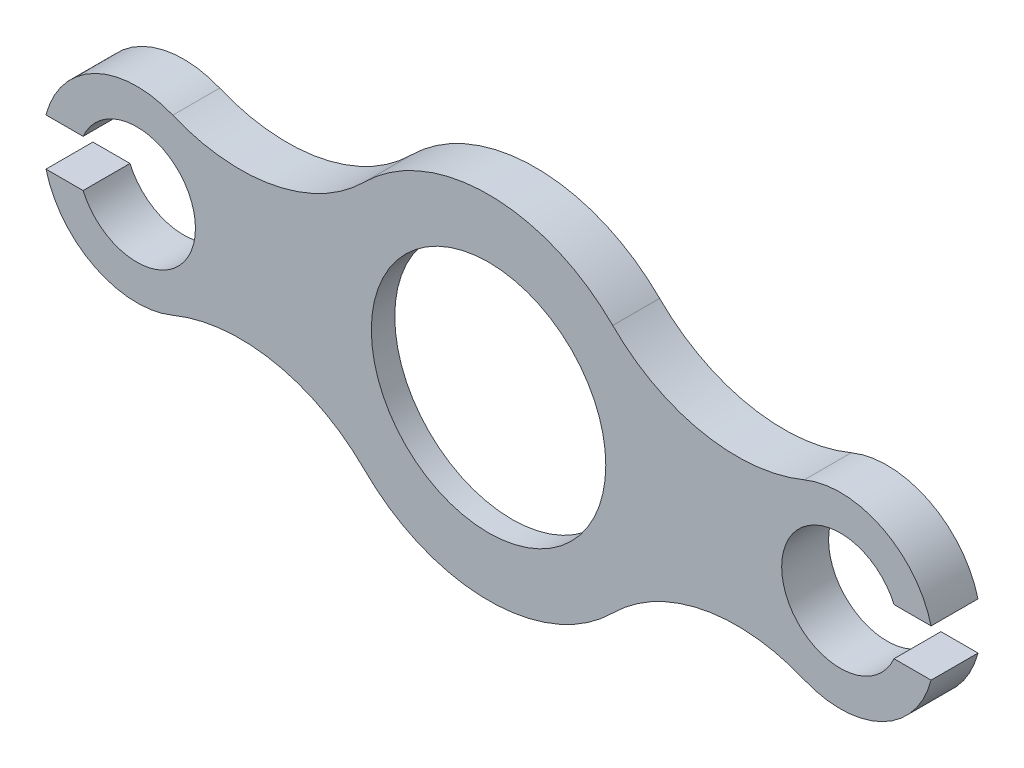
ISO-10303-21;
HEADER;
FILE_DESCRIPTION(('STEP AP214'),'2;1');
FILE_NAME('part.step','',(''),(''),'','','');
FILE_SCHEMA(('AUTOMOTIVE_DESIGN { 1 0 10303 214 1 1 1 1 }'));
ENDSEC;
DATA;
#1=APPLICATION_CONTEXT('core data for automotive mechanical design processes');
#2=APPLICATION_PROTOCOL_DEFINITION('international standard','automotive_design',2000,#1);
#3=PRODUCT_CONTEXT('',#1,'mechanical');
#4=PRODUCT('Part','Part','',(#3));
#5=PRODUCT_RELATED_PRODUCT_CATEGORY('part','',(#4));
#6=PRODUCT_DEFINITION_FORMATION('','',#4);
#7=PRODUCT_DEFINITION_CONTEXT('part definition',#1,'design');
#8=PRODUCT_DEFINITION('design','',#6,#7);
#9=PRODUCT_DEFINITION_SHAPE('','',#8);
#10=(LENGTH_UNIT() NAMED_UNIT(*) SI_UNIT(.MILLI.,.METRE.));
#11=(NAMED_UNIT(*) PLANE_ANGLE_UNIT() SI_UNIT($,.RADIAN.));
#12=(NAMED_UNIT(*) SI_UNIT($,.STERADIAN.) SOLID_ANGLE_UNIT());
#13=UNCERTAINTY_MEASURE_WITH_UNIT(LENGTH_MEASURE(1.E-05),#10,'distance_accuracy_value','');
#14=(GEOMETRIC_REPRESENTATION_CONTEXT(3) GLOBAL_UNCERTAINTY_ASSIGNED_CONTEXT((#13)) GLOBAL_UNIT_ASSIGNED_CONTEXT((#10,
#11,#12)) REPRESENTATION_CONTEXT('',''));
#15=CARTESIAN_POINT('',(0.,0.,0.));
#16=DIRECTION('',(0.,0.,1.));
#17=DIRECTION('',(1.,0.,0.));
#18=AXIS2_PLACEMENT_3D('',#15,#16,#17);
#19=CARTESIAN_POINT('',(-105.916666666667,-106.215157685813,20.));
#20=DIRECTION('',(0.,0.,-1.));
#21=DIRECTION('',(-1.,0.,0.));
#22=AXIS2_PLACEMENT_3D('',#19,#20,#21);
#23=CYLINDRICAL_SURFACE('',#22,75.);
#24=CARTESIAN_POINT('',(-105.916666666667,-106.215157685813,0.));
#25=DIRECTION('',(0.,0.,1.));
#26=DIRECTION('',(1.,0.,0.));
#27=AXIS2_PLACEMENT_3D('',#24,#25,#26);
#28=CIRCLE('',#27,75.);
#29=CARTESIAN_POINT('',(-134.666666666667,-36.9444026733264,0.));
#30=VERTEX_POINT('',#29);
#31=CARTESIAN_POINT('',(-52.9583333333333,-53.1075788429067,0.));
#32=VERTEX_POINT('',#31);
#33=EDGE_CURVE('E195',#30,#32,#28,.F.);
#34=ORIENTED_EDGE('',*,*,#33,.T.);
#35=DIRECTION('',(0.,0.,-1.));
#36=VECTOR('',#35,1.);
#37=CARTESIAN_POINT('',(-52.9583333333333,-53.1075788429067,20.));
#38=LINE('',#37,#36);
#39=CARTESIAN_POINT('',(-52.9583333333333,-53.1075788429067,20.));
#40=VERTEX_POINT('',#39);
#41=EDGE_CURVE('E11',#40,#32,#38,.T.);
#42=ORIENTED_EDGE('',*,*,#41,.F.);
#43=CARTESIAN_POINT('',(-105.916666666667,-106.215157685813,20.));
#44=DIRECTION('',(0.,0.,1.));
#45=DIRECTION('',(1.,0.,0.));
#46=AXIS2_PLACEMENT_3D('',#43,#44,#45);
#47=CIRCLE('',#46,75.);
#48=CARTESIAN_POINT('',(-134.666666666667,-36.9444026733264,20.));
#49=VERTEX_POINT('',#48);
#50=EDGE_CURVE('E233',#49,#40,#47,.F.);
#51=ORIENTED_EDGE('',*,*,#50,.F.);
#52=DIRECTION('',(0.,0.,-1.));
#53=VECTOR('',#52,1.);
#54=CARTESIAN_POINT('',(-134.666666666667,-36.9444026733264,20.));
#55=LINE('',#54,#53);
#56=EDGE_CURVE('E194',#49,#30,#55,.T.);
#57=ORIENTED_EDGE('',*,*,#56,.T.);
#58=EDGE_LOOP('',(#34,#42,#51,#57));
#59=FACE_BOUND('',#58,.T.);
#60=ADVANCED_FACE('F45',(#59),#23,.F.);
#61=CARTESIAN_POINT('',(0.,0.,20.));
#62=DIRECTION('',(0.,0.,-1.));
#63=DIRECTION('',(-1.,0.,0.));
#64=AXIS2_PLACEMENT_3D('',#61,#62,#63);
#65=CYLINDRICAL_SURFACE('',#64,75.);
#66=CARTESIAN_POINT('',(0.,0.,0.));
#67=DIRECTION('',(0.,0.,1.));
#68=DIRECTION('',(1.,0.,0.));
#69=AXIS2_PLACEMENT_3D('',#66,#67,#68);
#70=CIRCLE('',#69,75.);
#71=CARTESIAN_POINT('',(52.9583333333333,-53.1075788429067,0.));
#72=VERTEX_POINT('',#71);
#73=EDGE_CURVE('E198',#32,#72,#70,.T.);
#74=ORIENTED_EDGE('',*,*,#73,.T.);
#75=DIRECTION('',(0.,0.,-1.));
#76=VECTOR('',#75,1.);
#77=CARTESIAN_POINT('',(52.9583333333333,-53.1075788429067,20.));
#78=LINE('',#77,#76);
#79=CARTESIAN_POINT('',(52.9583333333333,-53.1075788429067,20.));
#80=VERTEX_POINT('',#79);
#81=EDGE_CURVE('E54',#80,#72,#78,.T.);
#82=ORIENTED_EDGE('',*,*,#81,.F.);
#83=CARTESIAN_POINT('',(0.,0.,20.));
#84=DIRECTION('',(0.,0.,1.));
#85=DIRECTION('',(1.,0.,0.));
#86=AXIS2_PLACEMENT_3D('',#83,#84,#85);
#87=CIRCLE('',#86,75.);
#88=EDGE_CURVE('E128',#40,#80,#87,.T.);
#89=ORIENTED_EDGE('',*,*,#88,.F.);
#90=ORIENTED_EDGE('',*,*,#41,.T.);
#91=EDGE_LOOP('',(#74,#82,#89,#90));
#92=FACE_BOUND('',#91,.T.);
#93=ADVANCED_FACE('F265',(#92),#65,.T.);
#94=CARTESIAN_POINT('',(105.916666666667,-106.215157685813,20.));
#95=DIRECTION('',(0.,0.,-1.));
#96=DIRECTION('',(-1.,0.,0.));
#97=AXIS2_PLACEMENT_3D('',#94,#95,#96);
#98=CYLINDRICAL_SURFACE('',#97,75.);
#99=CARTESIAN_POINT('',(105.916666666667,-106.215157685813,0.));
#100=DIRECTION('',(0.,0.,1.));
#101=DIRECTION('',(1.,0.,0.));
#102=AXIS2_PLACEMENT_3D('',#99,#100,#101);
#103=CIRCLE('',#102,75.);
#104=CARTESIAN_POINT('',(134.666666666667,-36.9444026733264,0.));
#105=VERTEX_POINT('',#104);
#106=EDGE_CURVE('E201',#105,#72,#103,.T.);
#107=ORIENTED_EDGE('',*,*,#106,.F.);
#108=DIRECTION('',(0.,0.,-1.));
#109=VECTOR('',#108,1.);
#110=CARTESIAN_POINT('',(134.666666666667,-36.9444026733264,20.));
#111=LINE('',#110,#109);
#112=CARTESIAN_POINT('',(134.666666666667,-36.9444026733264,20.));
#113=VERTEX_POINT('',#112);
#114=EDGE_CURVE('E257',#113,#105,#111,.T.);
#115=ORIENTED_EDGE('',*,*,#114,.F.);
#116=CARTESIAN_POINT('',(105.916666666667,-106.215157685813,20.));
#117=DIRECTION('',(0.,0.,1.));
#118=DIRECTION('',(1.,0.,0.));
#119=AXIS2_PLACEMENT_3D('',#116,#117,#118);
#120=CIRCLE('',#119,75.);
#121=EDGE_CURVE('E264',#113,#80,#120,.T.);
#122=ORIENTED_EDGE('',*,*,#121,.T.);
#123=ORIENTED_EDGE('',*,*,#81,.T.);
#124=EDGE_LOOP('',(#107,#115,#122,#123));
#125=FACE_BOUND('',#124,.T.);
#126=ADVANCED_FACE('F262',(#125),#98,.F.);
#127=CARTESIAN_POINT('',(150.,0.,20.));
#128=DIRECTION('',(0.,0.,-1.));
#129=DIRECTION('',(-1.,0.,0.));
#130=AXIS2_PLACEMENT_3D('',#127,#128,#129);
#131=CYLINDRICAL_SURFACE('',#130,40.);
#132=CARTESIAN_POINT('',(150.,0.,0.));
#133=DIRECTION('',(0.,0.,1.));
#134=DIRECTION('',(1.,0.,0.));
#135=AXIS2_PLACEMENT_3D('',#132,#133,#134);
#136=CIRCLE('',#135,40.);
#137=CARTESIAN_POINT('',(188.729833462074,-10.,0.));
#138=VERTEX_POINT('',#137);
#139=EDGE_CURVE('E205',#138,#105,#136,.F.);
#140=ORIENTED_EDGE('',*,*,#139,.F.);
#141=DIRECTION('',(0.,0.,-1.));
#142=VECTOR('',#141,1.);
#143=CARTESIAN_POINT('',(188.729833462074,-10.,20.));
#144=LINE('',#143,#142);
#145=CARTESIAN_POINT('',(188.729833462074,-10.,20.));
#146=VERTEX_POINT('',#145);
#147=EDGE_CURVE('E255',#146,#138,#144,.T.);
#148=ORIENTED_EDGE('',*,*,#147,.F.);
#149=CARTESIAN_POINT('',(150.,0.,20.));
#150=DIRECTION('',(0.,0.,1.));
#151=DIRECTION('',(1.,0.,0.));
#152=AXIS2_PLACEMENT_3D('',#149,#150,#151);
#153=CIRCLE('',#152,40.);
#154=EDGE_CURVE('E277',#146,#113,#153,.F.);
#155=ORIENTED_EDGE('',*,*,#154,.T.);
#156=ORIENTED_EDGE('',*,*,#114,.T.);
#157=EDGE_LOOP('',(#140,#148,#155,#156));
#158=FACE_BOUND('',#157,.T.);
#159=ADVANCED_FACE('F274',(#158),#131,.T.);
#160=CARTESIAN_POINT('',(0.,-10.,20.));
#161=DIRECTION('',(0.,1.,0.));
#162=DIRECTION('',(0.,0.,1.));
#163=AXIS2_PLACEMENT_3D('',#160,#161,#162);
#164=PLANE('',#163);
#165=DIRECTION('',(1.,0.,0.));
#166=VECTOR('',#165,1.);
#167=CARTESIAN_POINT('',(0.,-10.,0.));
#168=LINE('',#167,#166);
#169=CARTESIAN_POINT('',(172.912878474779,-10.,0.));
#170=VERTEX_POINT('',#169);
#171=EDGE_CURVE('E208',#170,#138,#168,.T.);
#172=ORIENTED_EDGE('',*,*,#171,.F.);
#173=DIRECTION('',(0.,0.,-1.));
#174=VECTOR('',#173,1.);
#175=CARTESIAN_POINT('',(172.912878474779,-10.,20.));
#176=LINE('',#175,#174);
#177=CARTESIAN_POINT('',(172.912878474779,-10.,20.));
#178=VERTEX_POINT('',#177);
#179=EDGE_CURVE('E253',#178,#170,#176,.T.);
#180=ORIENTED_EDGE('',*,*,#179,.F.);
#181=DIRECTION('',(1.,0.,0.));
#182=VECTOR('',#181,1.);
#183=CARTESIAN_POINT('',(0.,-10.,20.));
#184=LINE('',#183,#182);
#185=EDGE_CURVE('E281',#178,#146,#184,.T.);
#186=ORIENTED_EDGE('',*,*,#185,.T.);
#187=ORIENTED_EDGE('',*,*,#147,.T.);
#188=EDGE_LOOP('',(#172,#180,#186,#187));
#189=FACE_BOUND('',#188,.T.);
#190=ADVANCED_FACE('F363',(#189),#164,.T.);
#191=CARTESIAN_POINT('',(150.,0.,20.));
#192=DIRECTION('',(0.,0.,-1.));
#193=DIRECTION('',(-1.,0.,0.));
#194=AXIS2_PLACEMENT_3D('',#191,#192,#193);
#195=CYLINDRICAL_SURFACE('',#194,25.);
#196=CARTESIAN_POINT('',(150.,0.,0.));
#197=DIRECTION('',(0.,0.,1.));
#198=DIRECTION('',(1.,0.,0.));
#199=AXIS2_PLACEMENT_3D('',#196,#197,#198);
#200=CIRCLE('',#199,25.);
#201=CARTESIAN_POINT('',(172.912878474779,10.,0.));
#202=VERTEX_POINT('',#201);
#203=EDGE_CURVE('E211',#170,#202,#200,.F.);
#204=ORIENTED_EDGE('',*,*,#203,.T.);
#205=DIRECTION('',(0.,0.,-1.));
#206=VECTOR('',#205,1.);
#207=CARTESIAN_POINT('',(172.912878474779,10.,20.));
#208=LINE('',#207,#206);
#209=CARTESIAN_POINT('',(172.912878474779,10.,20.));
#210=VERTEX_POINT('',#209);
#211=EDGE_CURVE('E250',#210,#202,#208,.T.);
#212=ORIENTED_EDGE('',*,*,#211,.F.);
#213=CARTESIAN_POINT('',(150.,0.,20.));
#214=DIRECTION('',(0.,0.,1.));
#215=DIRECTION('',(1.,0.,0.));
#216=AXIS2_PLACEMENT_3D('',#213,#214,#215);
#217=CIRCLE('',#216,25.);
#218=EDGE_CURVE('E288',#178,#210,#217,.F.);
#219=ORIENTED_EDGE('',*,*,#218,.F.);
#220=ORIENTED_EDGE('',*,*,#179,.T.);
#221=EDGE_LOOP('',(#204,#212,#219,#220));
#222=FACE_BOUND('',#221,.T.);
#223=ADVANCED_FACE('F365',(#222),#195,.F.);
#224=CARTESIAN_POINT('',(0.,10.,20.));
#225=DIRECTION('',(0.,1.,0.));
#226=DIRECTION('',(0.,0.,1.));
#227=AXIS2_PLACEMENT_3D('',#224,#225,#226);
#228=PLANE('',#227);
#229=DIRECTION('',(1.,0.,0.));
#230=VECTOR('',#229,1.);
#231=CARTESIAN_POINT('',(0.,10.,0.));
#232=LINE('',#231,#230);
#233=CARTESIAN_POINT('',(188.729833462074,10.,0.));
#234=VERTEX_POINT('',#233);
#235=EDGE_CURVE('E213',#202,#234,#232,.T.);
#236=ORIENTED_EDGE('',*,*,#235,.T.);
#237=DIRECTION('',(0.,0.,-1.));
#238=VECTOR('',#237,1.);
#239=CARTESIAN_POINT('',(188.729833462074,10.,20.));
#240=LINE('',#239,#238);
#241=CARTESIAN_POINT('',(188.729833462074,10.,20.));
#242=VERTEX_POINT('',#241);
#243=EDGE_CURVE('E248',#242,#234,#240,.T.);
#244=ORIENTED_EDGE('',*,*,#243,.F.);
#245=DIRECTION('',(1.,0.,0.));
#246=VECTOR('',#245,1.);
#247=CARTESIAN_POINT('',(0.,10.,20.));
#248=LINE('',#247,#246);
#249=EDGE_CURVE('E290',#210,#242,#248,.T.);
#250=ORIENTED_EDGE('',*,*,#249,.F.);
#251=ORIENTED_EDGE('',*,*,#211,.T.);
#252=EDGE_LOOP('',(#236,#244,#250,#251));
#253=FACE_BOUND('',#252,.T.);
#254=ADVANCED_FACE('F359',(#253),#228,.F.);
#255=CARTESIAN_POINT('',(150.,0.,20.));
#256=DIRECTION('',(0.,0.,-1.));
#257=DIRECTION('',(-1.,0.,0.));
#258=AXIS2_PLACEMENT_3D('',#255,#256,#257);
#259=CYLINDRICAL_SURFACE('',#258,40.);
#260=CARTESIAN_POINT('',(150.,0.,0.));
#261=DIRECTION('',(0.,0.,1.));
#262=DIRECTION('',(1.,0.,0.));
#263=AXIS2_PLACEMENT_3D('',#260,#261,#262);
#264=CIRCLE('',#263,40.);
#265=CARTESIAN_POINT('',(134.666666666667,36.9444026733264,0.));
#266=VERTEX_POINT('',#265);
#267=EDGE_CURVE('E216',#266,#234,#264,.F.);
#268=ORIENTED_EDGE('',*,*,#267,.F.);
#269=DIRECTION('',(0.,0.,-1.));
#270=VECTOR('',#269,1.);
#271=CARTESIAN_POINT('',(134.666666666667,36.9444026733264,20.));
#272=LINE('',#271,#270);
#273=CARTESIAN_POINT('',(134.666666666667,36.9444026733264,20.));
#274=VERTEX_POINT('',#273);
#275=EDGE_CURVE('E246',#274,#266,#272,.T.);
#276=ORIENTED_EDGE('',*,*,#275,.F.);
#277=CARTESIAN_POINT('',(150.,0.,20.));
#278=DIRECTION('',(0.,0.,1.));
#279=DIRECTION('',(1.,0.,0.));
#280=AXIS2_PLACEMENT_3D('',#277,#278,#279);
#281=CIRCLE('',#280,40.);
#282=EDGE_CURVE('E292',#274,#242,#281,.F.);
#283=ORIENTED_EDGE('',*,*,#282,.T.);
#284=ORIENTED_EDGE('',*,*,#243,.T.);
#285=EDGE_LOOP('',(#268,#276,#283,#284));
#286=FACE_BOUND('',#285,.T.);
#287=ADVANCED_FACE('F342',(#286),#259,.T.);
#288=CARTESIAN_POINT('',(105.916666666667,106.215157685813,20.));
#289=DIRECTION('',(0.,0.,-1.));
#290=DIRECTION('',(-1.,0.,0.));
#291=AXIS2_PLACEMENT_3D('',#288,#289,#290);
#292=CYLINDRICAL_SURFACE('',#291,75.);
#293=CARTESIAN_POINT('',(105.916666666667,106.215157685813,0.));
#294=DIRECTION('',(0.,0.,1.));
#295=DIRECTION('',(1.,0.,0.));
#296=AXIS2_PLACEMENT_3D('',#293,#294,#295);
#297=CIRCLE('',#296,75.);
#298=CARTESIAN_POINT('',(52.9583333333334,53.1075788429067,0.));
#299=VERTEX_POINT('',#298);
#300=EDGE_CURVE('E219',#266,#299,#297,.F.);
#301=ORIENTED_EDGE('',*,*,#300,.T.);
#302=DIRECTION('',(0.,0.,-1.));
#303=VECTOR('',#302,1.);
#304=CARTESIAN_POINT('',(52.9583333333334,53.1075788429067,20.));
#305=LINE('',#304,#303);
#306=CARTESIAN_POINT('',(52.9583333333334,53.1075788429067,20.));
#307=VERTEX_POINT('',#306);
#308=EDGE_CURVE('E243',#307,#299,#305,.T.);
#309=ORIENTED_EDGE('',*,*,#308,.F.);
#310=CARTESIAN_POINT('',(105.916666666667,106.215157685813,20.));
#311=DIRECTION('',(0.,0.,1.));
#312=DIRECTION('',(1.,0.,0.));
#313=AXIS2_PLACEMENT_3D('',#310,#311,#312);
#314=CIRCLE('',#313,75.);
#315=EDGE_CURVE('E295',#274,#307,#314,.F.);
#316=ORIENTED_EDGE('',*,*,#315,.F.);
#317=ORIENTED_EDGE('',*,*,#275,.T.);
#318=EDGE_LOOP('',(#301,#309,#316,#317));
#319=FACE_BOUND('',#318,.T.);
#320=ADVANCED_FACE('F335',(#319),#292,.F.);
#321=CARTESIAN_POINT('',(-52.9583333333334,53.1075788429067,0.));
#322=VERTEX_POINT('',#321);
#323=EDGE_CURVE('E202',#299,#322,#70,.T.);
#324=ORIENTED_EDGE('',*,*,#323,.T.);
#325=DIRECTION('',(0.,0.,-1.));
#326=VECTOR('',#325,1.);
#327=CARTESIAN_POINT('',(-52.9583333333334,53.1075788429067,20.));
#328=LINE('',#327,#326);
#329=CARTESIAN_POINT('',(-52.9583333333334,53.1075788429067,20.));
#330=VERTEX_POINT('',#329);
#331=EDGE_CURVE('E241',#330,#322,#328,.T.);
#332=ORIENTED_EDGE('',*,*,#331,.F.);
#333=EDGE_CURVE('E284',#307,#330,#87,.T.);
#334=ORIENTED_EDGE('',*,*,#333,.F.);
#335=ORIENTED_EDGE('',*,*,#308,.T.);
#336=EDGE_LOOP('',(#324,#332,#334,#335));
#337=FACE_BOUND('',#336,.T.);
#338=ADVANCED_FACE('F327',(#337),#65,.T.);
#339=CARTESIAN_POINT('',(-105.916666666667,106.215157685813,20.));
#340=DIRECTION('',(0.,0.,-1.));
#341=DIRECTION('',(-1.,0.,0.));
#342=AXIS2_PLACEMENT_3D('',#339,#340,#341);
#343=CYLINDRICAL_SURFACE('',#342,75.);
#344=CARTESIAN_POINT('',(-105.916666666667,106.215157685813,0.));
#345=DIRECTION('',(0.,0.,1.));
#346=DIRECTION('',(1.,0.,0.));
#347=AXIS2_PLACEMENT_3D('',#344,#345,#346);
#348=CIRCLE('',#347,75.);
#349=CARTESIAN_POINT('',(-134.666666666667,36.9444026733264,0.));
#350=VERTEX_POINT('',#349);
#351=EDGE_CURVE('E221',#350,#322,#348,.T.);
#352=ORIENTED_EDGE('',*,*,#351,.F.);
#353=DIRECTION('',(0.,0.,-1.));
#354=VECTOR('',#353,1.);
#355=CARTESIAN_POINT('',(-134.666666666667,36.9444026733264,20.));
#356=LINE('',#355,#354);
#357=CARTESIAN_POINT('',(-134.666666666667,36.9444026733264,20.));
#358=VERTEX_POINT('',#357);
#359=EDGE_CURVE('E239',#358,#350,#356,.T.);
#360=ORIENTED_EDGE('',*,*,#359,.F.);
#361=CARTESIAN_POINT('',(-105.916666666667,106.215157685813,20.));
#362=DIRECTION('',(0.,0.,1.));
#363=DIRECTION('',(1.,0.,0.));
#364=AXIS2_PLACEMENT_3D('',#361,#362,#363);
#365=CIRCLE('',#364,75.);
#366=EDGE_CURVE('E297',#358,#330,#365,.T.);
#367=ORIENTED_EDGE('',*,*,#366,.T.);
#368=ORIENTED_EDGE('',*,*,#331,.T.);
#369=EDGE_LOOP('',(#352,#360,#367,#368));
#370=FACE_BOUND('',#369,.T.);
#371=ADVANCED_FACE('F334',(#370),#343,.F.);
#372=CARTESIAN_POINT('',(-150.,0.,20.));
#373=DIRECTION('',(0.,0.,-1.));
#374=DIRECTION('',(-1.,0.,0.));
#375=AXIS2_PLACEMENT_3D('',#372,#373,#374);
#376=CYLINDRICAL_SURFACE('',#375,40.);
#377=CARTESIAN_POINT('',(-150.,0.,0.));
#378=DIRECTION('',(0.,0.,1.));
#379=DIRECTION('',(1.,0.,0.));
#380=AXIS2_PLACEMENT_3D('',#377,#378,#379);
#381=CIRCLE('',#380,40.);
#382=CARTESIAN_POINT('',(-188.729833462074,10.,0.));
#383=VERTEX_POINT('',#382);
#384=EDGE_CURVE('E224',#350,#383,#381,.T.);
#385=ORIENTED_EDGE('',*,*,#384,.T.);
#386=DIRECTION('',(0.,0.,-1.));
#387=VECTOR('',#386,1.);
#388=CARTESIAN_POINT('',(-188.729833462074,10.,20.));
#389=LINE('',#388,#387);
#390=CARTESIAN_POINT('',(-188.729833462074,10.,20.));
#391=VERTEX_POINT('',#390);
#392=EDGE_CURVE('E237',#391,#383,#389,.T.);
#393=ORIENTED_EDGE('',*,*,#392,.F.);
#394=CARTESIAN_POINT('',(-150.,0.,20.));
#395=DIRECTION('',(0.,0.,1.));
#396=DIRECTION('',(1.,0.,0.));
#397=AXIS2_PLACEMENT_3D('',#394,#395,#396);
#398=CIRCLE('',#397,40.);
#399=EDGE_CURVE('E186',#358,#391,#398,.T.);
#400=ORIENTED_EDGE('',*,*,#399,.F.);
#401=ORIENTED_EDGE('',*,*,#359,.T.);
#402=EDGE_LOOP('',(#385,#393,#400,#401));
#403=FACE_BOUND('',#402,.T.);
#404=ADVANCED_FACE('F303',(#403),#376,.T.);
#405=CARTESIAN_POINT('',(0.,10.,20.));
#406=DIRECTION('',(0.,-1.,0.));
#407=DIRECTION('',(0.,0.,-1.));
#408=AXIS2_PLACEMENT_3D('',#405,#406,#407);
#409=PLANE('',#408);
#410=DIRECTION('',(-1.,0.,0.));
#411=VECTOR('',#410,1.);
#412=CARTESIAN_POINT('',(0.,10.,0.));
#413=LINE('',#412,#411);
#414=CARTESIAN_POINT('',(-172.912878474779,10.,0.));
#415=VERTEX_POINT('',#414);
#416=EDGE_CURVE('E227',#415,#383,#413,.T.);
#417=ORIENTED_EDGE('',*,*,#416,.F.);
#418=DIRECTION('',(0.,0.,-1.));
#419=VECTOR('',#418,1.);
#420=CARTESIAN_POINT('',(-172.912878474779,10.,20.));
#421=LINE('',#420,#419);
#422=CARTESIAN_POINT('',(-172.912878474779,10.,20.));
#423=VERTEX_POINT('',#422);
#424=EDGE_CURVE('E174',#423,#415,#421,.T.);
#425=ORIENTED_EDGE('',*,*,#424,.F.);
#426=DIRECTION('',(-1.,0.,0.));
#427=VECTOR('',#426,1.);
#428=CARTESIAN_POINT('',(0.,10.,20.));
#429=LINE('',#428,#427);
#430=EDGE_CURVE('E184',#423,#391,#429,.T.);
#431=ORIENTED_EDGE('',*,*,#430,.T.);
#432=ORIENTED_EDGE('',*,*,#392,.T.);
#433=EDGE_LOOP('',(#417,#425,#431,#432));
#434=FACE_BOUND('',#433,.T.);
#435=ADVANCED_FACE('F307',(#434),#409,.T.);
#436=CARTESIAN_POINT('',(-150.,0.,20.));
#437=DIRECTION('',(0.,0.,-1.));
#438=DIRECTION('',(-1.,0.,0.));
#439=AXIS2_PLACEMENT_3D('',#436,#437,#438);
#440=CYLINDRICAL_SURFACE('',#439,25.);
#441=CARTESIAN_POINT('',(-150.,0.,0.));
#442=DIRECTION('',(0.,0.,1.));
#443=DIRECTION('',(1.,0.,0.));
#444=AXIS2_PLACEMENT_3D('',#441,#442,#443);
#445=CIRCLE('',#444,25.);
#446=CARTESIAN_POINT('',(-172.912878474779,-10.,0.));
#447=VERTEX_POINT('',#446);
#448=EDGE_CURVE('E173',#447,#415,#445,.T.);
#449=ORIENTED_EDGE('',*,*,#448,.F.);
#450=DIRECTION('',(0.,0.,-1.));
#451=VECTOR('',#450,1.);
#452=CARTESIAN_POINT('',(-172.912878474779,-10.,20.));
#453=LINE('',#452,#451);
#454=CARTESIAN_POINT('',(-172.912878474779,-10.,20.));
#455=VERTEX_POINT('',#454);
#456=EDGE_CURVE('E167',#455,#447,#453,.T.);
#457=ORIENTED_EDGE('',*,*,#456,.F.);
#458=CARTESIAN_POINT('',(-150.,0.,20.));
#459=DIRECTION('',(0.,0.,1.));
#460=DIRECTION('',(1.,0.,0.));
#461=AXIS2_PLACEMENT_3D('',#458,#459,#460);
#462=CIRCLE('',#461,25.);
#463=EDGE_CURVE('E171',#455,#423,#462,.T.);
#464=ORIENTED_EDGE('',*,*,#463,.T.);
#465=ORIENTED_EDGE('',*,*,#424,.T.);
#466=EDGE_LOOP('',(#449,#457,#464,#465));
#467=FACE_BOUND('',#466,.T.);
#468=ADVANCED_FACE('F169',(#467),#440,.F.);
#469=CARTESIAN_POINT('',(0.,-10.,20.));
#470=DIRECTION('',(0.,-1.,0.));
#471=DIRECTION('',(0.,0.,-1.));
#472=AXIS2_PLACEMENT_3D('',#469,#470,#471);
#473=PLANE('',#472);
#474=DIRECTION('',(-1.,0.,0.));
#475=VECTOR('',#474,1.);
#476=CARTESIAN_POINT('',(0.,-10.,0.));
#477=LINE('',#476,#475);
#478=CARTESIAN_POINT('',(-188.729833462074,-10.,0.));
#479=VERTEX_POINT('',#478);
#480=EDGE_CURVE('E114',#447,#479,#477,.T.);
#481=ORIENTED_EDGE('',*,*,#480,.T.);
#482=DIRECTION('',(0.,0.,-1.));
#483=VECTOR('',#482,1.);
#484=CARTESIAN_POINT('',(-188.729833462074,-10.,20.));
#485=LINE('',#484,#483);
#486=CARTESIAN_POINT('',(-188.729833462074,-10.,20.));
#487=VERTEX_POINT('',#486);
#488=EDGE_CURVE('E175',#487,#479,#485,.T.);
#489=ORIENTED_EDGE('',*,*,#488,.F.);
#490=DIRECTION('',(-1.,0.,0.));
#491=VECTOR('',#490,1.);
#492=CARTESIAN_POINT('',(0.,-10.,20.));
#493=LINE('',#492,#491);
#494=EDGE_CURVE('E177',#455,#487,#493,.T.);
#495=ORIENTED_EDGE('',*,*,#494,.F.);
#496=ORIENTED_EDGE('',*,*,#456,.T.);
#497=EDGE_LOOP('',(#481,#489,#495,#496));
#498=FACE_BOUND('',#497,.T.);
#499=ADVANCED_FACE('F178',(#498),#473,.F.);
#500=CARTESIAN_POINT('',(-150.,0.,20.));
#501=DIRECTION('',(0.,0.,-1.));
#502=DIRECTION('',(-1.,0.,0.));
#503=AXIS2_PLACEMENT_3D('',#500,#501,#502);
#504=CYLINDRICAL_SURFACE('',#503,40.);
#505=CARTESIAN_POINT('',(-150.,0.,0.));
#506=DIRECTION('',(0.,0.,1.));
#507=DIRECTION('',(1.,0.,0.));
#508=AXIS2_PLACEMENT_3D('',#505,#506,#507);
#509=CIRCLE('',#508,40.);
#510=EDGE_CURVE('E120',#479,#30,#509,.T.);
#511=ORIENTED_EDGE('',*,*,#510,.T.);
#512=ORIENTED_EDGE('',*,*,#56,.F.);
#513=CARTESIAN_POINT('',(-150.,0.,20.));
#514=DIRECTION('',(0.,0.,1.));
#515=DIRECTION('',(1.,0.,0.));
#516=AXIS2_PLACEMENT_3D('',#513,#514,#515);
#517=CIRCLE('',#516,40.);
#518=EDGE_CURVE('E62',#487,#49,#517,.T.);
#519=ORIENTED_EDGE('',*,*,#518,.F.);
#520=ORIENTED_EDGE('',*,*,#488,.T.);
#521=EDGE_LOOP('',(#511,#512,#519,#520));
#522=FACE_BOUND('',#521,.T.);
#523=ADVANCED_FACE('F310',(#522),#504,.T.);
#524=CARTESIAN_POINT('',(0.,0.,20.));
#525=DIRECTION('',(0.,0.,-1.));
#526=DIRECTION('',(-1.,0.,0.));
#527=AXIS2_PLACEMENT_3D('',#524,#525,#526);
#528=CYLINDRICAL_SURFACE('',#527,50.);
#529=CARTESIAN_POINT('',(0.,0.,10.));
#530=DIRECTION('',(0.,0.,1.));
#531=DIRECTION('',(1.,0.,0.));
#532=AXIS2_PLACEMENT_3D('',#529,#530,#531);
#533=CIRCLE('',#532,50.);
#534=CARTESIAN_POINT('',(50.,0.,10.));
#535=VERTEX_POINT('',#534);
#536=EDGE_CURVE('E48',#535,#535,#533,.T.);
#537=ORIENTED_EDGE('',*,*,#536,.F.);
#538=EDGE_LOOP('',(#537));
#539=FACE_BOUND('',#538,.T.);
#540=CARTESIAN_POINT('',(0.,0.,20.));
#541=DIRECTION('',(0.,0.,1.));
#542=DIRECTION('',(1.,0.,0.));
#543=AXIS2_PLACEMENT_3D('',#540,#541,#542);
#544=CIRCLE('',#543,50.);
#545=CARTESIAN_POINT('',(50.,0.,20.));
#546=VERTEX_POINT('',#545);
#547=EDGE_CURVE('E191',#546,#546,#544,.T.);
#548=ORIENTED_EDGE('',*,*,#547,.T.);
#549=EDGE_LOOP('',(#548));
#550=FACE_BOUND('',#549,.T.);
#551=ADVANCED_FACE('F312',(#539,#550),#528,.F.);
#552=CARTESIAN_POINT('',(0.,0.,20.));
#553=DIRECTION('',(0.,0.,1.));
#554=DIRECTION('',(1.,0.,0.));
#555=AXIS2_PLACEMENT_3D('',#552,#553,#554);
#556=PLANE('',#555);
#557=ORIENTED_EDGE('',*,*,#50,.T.);
#558=ORIENTED_EDGE('',*,*,#88,.T.);
#559=ORIENTED_EDGE('',*,*,#121,.F.);
#560=ORIENTED_EDGE('',*,*,#154,.F.);
#561=ORIENTED_EDGE('',*,*,#185,.F.);
#562=ORIENTED_EDGE('',*,*,#218,.T.);
#563=ORIENTED_EDGE('',*,*,#249,.T.);
#564=ORIENTED_EDGE('',*,*,#282,.F.);
#565=ORIENTED_EDGE('',*,*,#315,.T.);
#566=ORIENTED_EDGE('',*,*,#333,.T.);
#567=ORIENTED_EDGE('',*,*,#366,.F.);
#568=ORIENTED_EDGE('',*,*,#399,.T.);
#569=ORIENTED_EDGE('',*,*,#430,.F.);
#570=ORIENTED_EDGE('',*,*,#463,.F.);
#571=ORIENTED_EDGE('',*,*,#494,.T.);
#572=ORIENTED_EDGE('',*,*,#518,.T.);
#573=EDGE_LOOP('',(#557,#558,#559,#560,#561,#562,#563,#564,#565,#566,#567,#568,#569,#570,#571,#572));
#574=FACE_BOUND('',#573,.T.);
#575=ORIENTED_EDGE('',*,*,#547,.F.);
#576=EDGE_LOOP('',(#575));
#577=FACE_BOUND('',#576,.T.);
#578=ADVANCED_FACE('F181',(#574,#577),#556,.T.);
#579=CARTESIAN_POINT('',(0.,0.,0.));
#580=DIRECTION('',(0.,0.,1.));
#581=DIRECTION('',(1.,0.,0.));
#582=AXIS2_PLACEMENT_3D('',#579,#580,#581);
#583=PLANE('',#582);
#584=CARTESIAN_POINT('',(0.,0.,0.));
#585=DIRECTION('',(0.,0.,1.));
#586=DIRECTION('',(1.,0.,0.));
#587=AXIS2_PLACEMENT_3D('',#584,#585,#586);
#588=CIRCLE('',#587,68.25);
#589=CARTESIAN_POINT('',(68.25,0.,0.));
#590=VERTEX_POINT('',#589);
#591=EDGE_CURVE('E523',#590,#590,#588,.T.);
#592=ORIENTED_EDGE('',*,*,#591,.T.);
#593=EDGE_LOOP('',(#592));
#594=FACE_BOUND('',#593,.T.);
#595=ORIENTED_EDGE('',*,*,#33,.F.);
#596=ORIENTED_EDGE('',*,*,#510,.F.);
#597=ORIENTED_EDGE('',*,*,#480,.F.);
#598=ORIENTED_EDGE('',*,*,#448,.T.);
#599=ORIENTED_EDGE('',*,*,#416,.T.);
#600=ORIENTED_EDGE('',*,*,#384,.F.);
#601=ORIENTED_EDGE('',*,*,#351,.T.);
#602=ORIENTED_EDGE('',*,*,#323,.F.);
#603=ORIENTED_EDGE('',*,*,#300,.F.);
#604=ORIENTED_EDGE('',*,*,#267,.T.);
#605=ORIENTED_EDGE('',*,*,#235,.F.);
#606=ORIENTED_EDGE('',*,*,#203,.F.);
#607=ORIENTED_EDGE('',*,*,#171,.T.);
#608=ORIENTED_EDGE('',*,*,#139,.T.);
#609=ORIENTED_EDGE('',*,*,#106,.T.);
#610=ORIENTED_EDGE('',*,*,#73,.F.);
#611=EDGE_LOOP('',(#595,#596,#597,#598,#599,#600,#601,#602,#603,#604,#605,#606,#607,#608,#609,#610));
#612=FACE_BOUND('',#611,.T.);
#613=ADVANCED_FACE('F269',(#594,#612),#583,.F.);
#614=CARTESIAN_POINT('',(0.,0.,10.));
#615=DIRECTION('',(0.,0.,-1.));
#616=DIRECTION('',(-1.,0.,0.));
#617=AXIS2_PLACEMENT_3D('',#614,#615,#616);
#618=CYLINDRICAL_SURFACE('',#617,68.25);
#619=CARTESIAN_POINT('',(0.,0.,10.));
#620=DIRECTION('',(0.,0.,1.));
#621=DIRECTION('',(1.,0.,0.));
#622=AXIS2_PLACEMENT_3D('',#619,#620,#621);
#623=CIRCLE('',#622,68.25);
#624=CARTESIAN_POINT('',(68.25,0.,10.));
#625=VERTEX_POINT('',#624);
#626=EDGE_CURVE('E522',#625,#625,#623,.T.);
#627=ORIENTED_EDGE('',*,*,#626,.T.);
#628=EDGE_LOOP('',(#627));
#629=FACE_BOUND('',#628,.T.);
#630=ORIENTED_EDGE('',*,*,#591,.F.);
#631=EDGE_LOOP('',(#630));
#632=FACE_BOUND('',#631,.T.);
#633=ADVANCED_FACE('F485',(#629,#632),#618,.F.);
#634=CARTESIAN_POINT('',(0.,0.,10.));
#635=DIRECTION('',(0.,0.,1.));
#636=DIRECTION('',(1.,0.,0.));
#637=AXIS2_PLACEMENT_3D('',#634,#635,#636);
#638=PLANE('',#637);
#639=ORIENTED_EDGE('',*,*,#536,.T.);
#640=EDGE_LOOP('',(#639));
#641=FACE_BOUND('',#640,.T.);
#642=ORIENTED_EDGE('',*,*,#626,.F.);
#643=EDGE_LOOP('',(#642));
#644=FACE_BOUND('',#643,.T.);
#645=ADVANCED_FACE('F504',(#641,#644),#638,.F.);
#646=CLOSED_SHELL('',(#60,#93,#126,#159,#190,#223,#254,#287,#320,#338,#371,#404,#435,#468,#499,
#523,#551,#578,#613,#633,#645));
#647=MANIFOLD_SOLID_BREP('B2',#646);
#648=ADVANCED_BREP_SHAPE_REPRESENTATION('',(#18,#647),#14);
#649=SHAPE_DEFINITION_REPRESENTATION(#9,#648);
ENDSEC;
END-ISO-10303-21;
